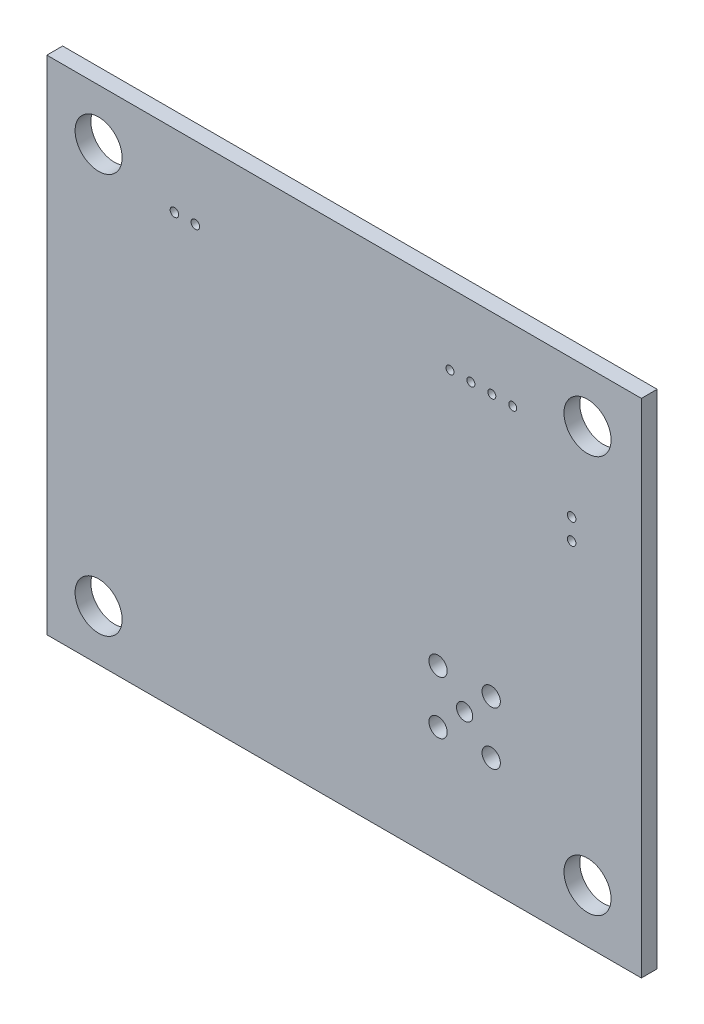
ISO-10303-21;
HEADER;
FILE_DESCRIPTION(('STEP AP214'),'2;1');
FILE_NAME('part.step','',(''),(''),'','','');
FILE_SCHEMA(('AUTOMOTIVE_DESIGN { 1 0 10303 214 1 1 1 1 }'));
ENDSEC;
DATA;
#1=APPLICATION_CONTEXT('core data for automotive mechanical design processes');
#2=APPLICATION_PROTOCOL_DEFINITION('international standard','automotive_design',2000,#1);
#3=PRODUCT_CONTEXT('',#1,'mechanical');
#4=PRODUCT('Part','Part','',(#3));
#5=PRODUCT_RELATED_PRODUCT_CATEGORY('part','',(#4));
#6=PRODUCT_DEFINITION_FORMATION('','',#4);
#7=PRODUCT_DEFINITION_CONTEXT('part definition',#1,'design');
#8=PRODUCT_DEFINITION('design','',#6,#7);
#9=PRODUCT_DEFINITION_SHAPE('','',#8);
#10=(LENGTH_UNIT() NAMED_UNIT(*) SI_UNIT(.MILLI.,.METRE.));
#11=(NAMED_UNIT(*) PLANE_ANGLE_UNIT() SI_UNIT($,.RADIAN.));
#12=(NAMED_UNIT(*) SI_UNIT($,.STERADIAN.) SOLID_ANGLE_UNIT());
#13=UNCERTAINTY_MEASURE_WITH_UNIT(LENGTH_MEASURE(1.E-05),#10,'distance_accuracy_value','');
#14=(GEOMETRIC_REPRESENTATION_CONTEXT(3) GLOBAL_UNCERTAINTY_ASSIGNED_CONTEXT((#13)) GLOBAL_UNIT_ASSIGNED_CONTEXT((#10,
#11,#12)) REPRESENTATION_CONTEXT('',''));
#15=CARTESIAN_POINT('',(0.,0.,0.));
#16=DIRECTION('',(0.,0.,1.));
#17=DIRECTION('',(1.,0.,0.));
#18=AXIS2_PLACEMENT_3D('',#15,#16,#17);
#19=CARTESIAN_POINT('',(180.75,-57.5,-0.046));
#20=DIRECTION('',(0.,0.,-1.));
#21=DIRECTION('',(0.,-1.,0.));
#22=AXIS2_PLACEMENT_3D('',#19,#20,#21);
#23=CYLINDRICAL_SURFACE('',#22,2.25);
#24=CARTESIAN_POINT('',(180.75,-57.5,0.));
#25=DIRECTION('',(0.,0.,-1.));
#26=DIRECTION('',(0.,-1.,0.));
#27=AXIS2_PLACEMENT_3D('',#24,#25,#26);
#28=CIRCLE('',#27,2.25);
#29=CARTESIAN_POINT('',(180.75,-59.75,0.));
#30=VERTEX_POINT('',#29);
#31=EDGE_CURVE('E274',#30,#30,#28,.T.);
#32=ORIENTED_EDGE('',*,*,#31,.T.);
#33=DIRECTION('',(0.,0.,1.));
#34=VECTOR('',#33,1.);
#35=CARTESIAN_POINT('',(180.75,-59.75,-0.046));
#36=LINE('',#35,#34);
#37=CARTESIAN_POINT('',(180.75,-59.75,1.51));
#38=VERTEX_POINT('',#37);
#39=EDGE_CURVE('E11',#30,#38,#36,.T.);
#40=ORIENTED_EDGE('',*,*,#39,.T.);
#41=CARTESIAN_POINT('',(180.75,-57.5,1.51));
#42=DIRECTION('',(0.,0.,-1.));
#43=DIRECTION('',(0.,-1.,0.));
#44=AXIS2_PLACEMENT_3D('',#41,#42,#43);
#45=CIRCLE('',#44,2.25);
#46=EDGE_CURVE('E267',#38,#38,#45,.T.);
#47=ORIENTED_EDGE('',*,*,#46,.F.);
#48=ORIENTED_EDGE('',*,*,#39,.F.);
#49=EDGE_LOOP('',(#32,#40,#47,#48));
#50=FACE_BOUND('',#49,.T.);
#51=ADVANCED_FACE('F17',(#50),#23,.F.);
#52=CARTESIAN_POINT('',(173.6,-59.4,-0.046));
#53=DIRECTION('',(0.,0.,-1.));
#54=DIRECTION('',(0.,-1.,0.));
#55=AXIS2_PLACEMENT_3D('',#52,#53,#54);
#56=CYLINDRICAL_SURFACE('',#55,0.381);
#57=CARTESIAN_POINT('',(173.6,-59.4,0.));
#58=DIRECTION('',(0.,0.,-1.));
#59=DIRECTION('',(0.,-1.,0.));
#60=AXIS2_PLACEMENT_3D('',#57,#58,#59);
#61=CIRCLE('',#60,0.381);
#62=CARTESIAN_POINT('',(173.6,-59.781,0.));
#63=VERTEX_POINT('',#62);
#64=EDGE_CURVE('E355',#63,#63,#61,.T.);
#65=ORIENTED_EDGE('',*,*,#64,.T.);
#66=DIRECTION('',(0.,0.,1.));
#67=VECTOR('',#66,1.);
#68=CARTESIAN_POINT('',(173.6,-59.781,-0.046));
#69=LINE('',#68,#67);
#70=CARTESIAN_POINT('',(173.6,-59.781,1.51));
#71=VERTEX_POINT('',#70);
#72=EDGE_CURVE('E25',#63,#71,#69,.T.);
#73=ORIENTED_EDGE('',*,*,#72,.T.);
#74=CARTESIAN_POINT('',(173.6,-59.4,1.51));
#75=DIRECTION('',(0.,0.,-1.));
#76=DIRECTION('',(0.,-1.,0.));
#77=AXIS2_PLACEMENT_3D('',#74,#75,#76);
#78=CIRCLE('',#77,0.381);
#79=EDGE_CURVE('E418',#71,#71,#78,.T.);
#80=ORIENTED_EDGE('',*,*,#79,.F.);
#81=ORIENTED_EDGE('',*,*,#72,.F.);
#82=EDGE_LOOP('',(#65,#73,#80,#81));
#83=FACE_BOUND('',#82,.T.);
#84=ADVANCED_FACE('F836',(#83),#56,.F.);
#85=CARTESIAN_POINT('',(171.600001,-59.4,-0.046));
#86=DIRECTION('',(0.,0.,-1.));
#87=DIRECTION('',(0.,-1.,0.));
#88=AXIS2_PLACEMENT_3D('',#85,#86,#87);
#89=CYLINDRICAL_SURFACE('',#88,0.381);
#90=CARTESIAN_POINT('',(171.600001,-59.4,0.));
#91=DIRECTION('',(0.,0.,-1.));
#92=DIRECTION('',(0.,-1.,0.));
#93=AXIS2_PLACEMENT_3D('',#90,#91,#92);
#94=CIRCLE('',#93,0.381);
#95=CARTESIAN_POINT('',(171.600001,-59.781,0.));
#96=VERTEX_POINT('',#95);
#97=EDGE_CURVE('E252',#96,#96,#94,.T.);
#98=ORIENTED_EDGE('',*,*,#97,.T.);
#99=DIRECTION('',(0.,0.,1.));
#100=VECTOR('',#99,1.);
#101=CARTESIAN_POINT('',(171.600001,-59.781,-0.046));
#102=LINE('',#101,#100);
#103=CARTESIAN_POINT('',(171.600001,-59.781,1.51));
#104=VERTEX_POINT('',#103);
#105=EDGE_CURVE('E289',#96,#104,#102,.T.);
#106=ORIENTED_EDGE('',*,*,#105,.T.);
#107=CARTESIAN_POINT('',(171.600001,-59.4,1.51));
#108=DIRECTION('',(0.,0.,-1.));
#109=DIRECTION('',(0.,-1.,0.));
#110=AXIS2_PLACEMENT_3D('',#107,#108,#109);
#111=CIRCLE('',#110,0.381);
#112=EDGE_CURVE('E362',#104,#104,#111,.T.);
#113=ORIENTED_EDGE('',*,*,#112,.F.);
#114=ORIENTED_EDGE('',*,*,#105,.F.);
#115=EDGE_LOOP('',(#98,#106,#113,#114));
#116=FACE_BOUND('',#115,.T.);
#117=ADVANCED_FACE('F827',(#116),#89,.F.);
#118=CARTESIAN_POINT('',(179.2326,-65.749999,-0.046));
#119=DIRECTION('',(0.,0.,-1.));
#120=DIRECTION('',(0.,-1.,0.));
#121=AXIS2_PLACEMENT_3D('',#118,#119,#120);
#122=CYLINDRICAL_SURFACE('',#121,0.4064);
#123=CARTESIAN_POINT('',(179.2326,-65.749999,0.));
#124=DIRECTION('',(0.,0.,-1.));
#125=DIRECTION('',(0.,-1.,0.));
#126=AXIS2_PLACEMENT_3D('',#123,#124,#125);
#127=CIRCLE('',#126,0.4064);
#128=CARTESIAN_POINT('',(179.2326,-66.156399,0.));
#129=VERTEX_POINT('',#128);
#130=EDGE_CURVE('E249',#129,#129,#127,.T.);
#131=ORIENTED_EDGE('',*,*,#130,.T.);
#132=DIRECTION('',(0.,0.,1.));
#133=VECTOR('',#132,1.);
#134=CARTESIAN_POINT('',(179.2326,-66.156399,-0.046));
#135=LINE('',#134,#133);
#136=CARTESIAN_POINT('',(179.2326,-66.156399,1.51));
#137=VERTEX_POINT('',#136);
#138=EDGE_CURVE('E292',#129,#137,#135,.T.);
#139=ORIENTED_EDGE('',*,*,#138,.T.);
#140=CARTESIAN_POINT('',(179.2326,-65.749999,1.51));
#141=DIRECTION('',(0.,0.,-1.));
#142=DIRECTION('',(0.,-1.,0.));
#143=AXIS2_PLACEMENT_3D('',#140,#141,#142);
#144=CIRCLE('',#143,0.4064);
#145=EDGE_CURVE('E358',#137,#137,#144,.T.);
#146=ORIENTED_EDGE('',*,*,#145,.F.);
#147=ORIENTED_EDGE('',*,*,#138,.F.);
#148=EDGE_LOOP('',(#131,#139,#146,#147));
#149=FACE_BOUND('',#148,.T.);
#150=ADVANCED_FACE('F817',(#149),#122,.F.);
#151=CARTESIAN_POINT('',(169.6,-59.4,-0.046));
#152=DIRECTION('',(0.,0.,-1.));
#153=DIRECTION('',(0.,-1.,0.));
#154=AXIS2_PLACEMENT_3D('',#151,#152,#153);
#155=CYLINDRICAL_SURFACE('',#154,0.381);
#156=CARTESIAN_POINT('',(169.6,-59.4,0.));
#157=DIRECTION('',(0.,0.,-1.));
#158=DIRECTION('',(0.,-1.,0.));
#159=AXIS2_PLACEMENT_3D('',#156,#157,#158);
#160=CIRCLE('',#159,0.381);
#161=CARTESIAN_POINT('',(169.6,-59.781,0.));
#162=VERTEX_POINT('',#161);
#163=EDGE_CURVE('E253',#162,#162,#160,.T.);
#164=ORIENTED_EDGE('',*,*,#163,.T.);
#165=DIRECTION('',(0.,0.,1.));
#166=VECTOR('',#165,1.);
#167=CARTESIAN_POINT('',(169.6,-59.781,-0.046));
#168=LINE('',#167,#166);
#169=CARTESIAN_POINT('',(169.6,-59.781,1.51));
#170=VERTEX_POINT('',#169);
#171=EDGE_CURVE('E247',#162,#170,#168,.T.);
#172=ORIENTED_EDGE('',*,*,#171,.T.);
#173=CARTESIAN_POINT('',(169.6,-59.4,1.51));
#174=DIRECTION('',(0.,0.,-1.));
#175=DIRECTION('',(0.,-1.,0.));
#176=AXIS2_PLACEMENT_3D('',#173,#174,#175);
#177=CIRCLE('',#176,0.381);
#178=EDGE_CURVE('E363',#170,#170,#177,.T.);
#179=ORIENTED_EDGE('',*,*,#178,.F.);
#180=ORIENTED_EDGE('',*,*,#171,.F.);
#181=EDGE_LOOP('',(#164,#172,#179,#180));
#182=FACE_BOUND('',#181,.T.);
#183=ADVANCED_FACE('F807',(#182),#155,.F.);
#184=CARTESIAN_POINT('',(167.600002,-59.4,-0.046));
#185=DIRECTION('',(0.,0.,-1.));
#186=DIRECTION('',(0.,-1.,0.));
#187=AXIS2_PLACEMENT_3D('',#184,#185,#186);
#188=CYLINDRICAL_SURFACE('',#187,0.381);
#189=CARTESIAN_POINT('',(167.600002,-59.4,0.));
#190=DIRECTION('',(0.,0.,-1.));
#191=DIRECTION('',(0.,-1.,0.));
#192=AXIS2_PLACEMENT_3D('',#189,#190,#191);
#193=CIRCLE('',#192,0.381);
#194=CARTESIAN_POINT('',(167.600002,-59.781,0.));
#195=VERTEX_POINT('',#194);
#196=EDGE_CURVE('E301',#195,#195,#193,.T.);
#197=ORIENTED_EDGE('',*,*,#196,.T.);
#198=DIRECTION('',(0.,0.,1.));
#199=VECTOR('',#198,1.);
#200=CARTESIAN_POINT('',(167.600002,-59.781,-0.046));
#201=LINE('',#200,#199);
#202=CARTESIAN_POINT('',(167.600002,-59.781,1.51));
#203=VERTEX_POINT('',#202);
#204=EDGE_CURVE('E244',#195,#203,#201,.T.);
#205=ORIENTED_EDGE('',*,*,#204,.T.);
#206=CARTESIAN_POINT('',(167.600002,-59.4,1.51));
#207=DIRECTION('',(0.,0.,-1.));
#208=DIRECTION('',(0.,-1.,0.));
#209=AXIS2_PLACEMENT_3D('',#206,#207,#208);
#210=CIRCLE('',#209,0.381);
#211=EDGE_CURVE('E370',#203,#203,#210,.T.);
#212=ORIENTED_EDGE('',*,*,#211,.F.);
#213=ORIENTED_EDGE('',*,*,#204,.F.);
#214=EDGE_LOOP('',(#197,#205,#212,#213));
#215=FACE_BOUND('',#214,.T.);
#216=ADVANCED_FACE('F797',(#215),#188,.F.);
#217=CARTESIAN_POINT('',(179.2326,-67.75,-0.046));
#218=DIRECTION('',(0.,0.,-1.));
#219=DIRECTION('',(0.,-1.,0.));
#220=AXIS2_PLACEMENT_3D('',#217,#218,#219);
#221=CYLINDRICAL_SURFACE('',#220,0.4064);
#222=CARTESIAN_POINT('',(179.2326,-67.75,0.));
#223=DIRECTION('',(0.,0.,-1.));
#224=DIRECTION('',(0.,-1.,0.));
#225=AXIS2_PLACEMENT_3D('',#222,#223,#224);
#226=CIRCLE('',#225,0.4064);
#227=CARTESIAN_POINT('',(179.2326,-68.1564,0.));
#228=VERTEX_POINT('',#227);
#229=EDGE_CURVE('E279',#228,#228,#226,.T.);
#230=ORIENTED_EDGE('',*,*,#229,.T.);
#231=DIRECTION('',(0.,0.,1.));
#232=VECTOR('',#231,1.);
#233=CARTESIAN_POINT('',(179.2326,-68.1564,-0.046));
#234=LINE('',#233,#232);
#235=CARTESIAN_POINT('',(179.2326,-68.1564,1.51));
#236=VERTEX_POINT('',#235);
#237=EDGE_CURVE('E248',#228,#236,#234,.T.);
#238=ORIENTED_EDGE('',*,*,#237,.T.);
#239=CARTESIAN_POINT('',(179.2326,-67.75,1.51));
#240=DIRECTION('',(0.,0.,-1.));
#241=DIRECTION('',(0.,-1.,0.));
#242=AXIS2_PLACEMENT_3D('',#239,#240,#241);
#243=CIRCLE('',#242,0.4064);
#244=EDGE_CURVE('E338',#236,#236,#243,.T.);
#245=ORIENTED_EDGE('',*,*,#244,.F.);
#246=ORIENTED_EDGE('',*,*,#237,.F.);
#247=EDGE_LOOP('',(#230,#238,#245,#246));
#248=FACE_BOUND('',#247,.T.);
#249=ADVANCED_FACE('F788',(#248),#221,.F.);
#250=CARTESIAN_POINT('',(143.25,-59.5174,-0.046));
#251=DIRECTION('',(0.,0.,-1.));
#252=DIRECTION('',(0.,-1.,0.));
#253=AXIS2_PLACEMENT_3D('',#250,#251,#252);
#254=CYLINDRICAL_SURFACE('',#253,0.4064);
#255=CARTESIAN_POINT('',(143.25,-59.5174,0.));
#256=DIRECTION('',(0.,0.,-1.));
#257=DIRECTION('',(0.,-1.,0.));
#258=AXIS2_PLACEMENT_3D('',#255,#256,#257);
#259=CIRCLE('',#258,0.4064);
#260=CARTESIAN_POINT('',(143.25,-59.9238,0.));
#261=VERTEX_POINT('',#260);
#262=EDGE_CURVE('E275',#261,#261,#259,.T.);
#263=ORIENTED_EDGE('',*,*,#262,.T.);
#264=DIRECTION('',(0.,0.,1.));
#265=VECTOR('',#264,1.);
#266=CARTESIAN_POINT('',(143.25,-59.9238,-0.046));
#267=LINE('',#266,#265);
#268=CARTESIAN_POINT('',(143.25,-59.9238,1.51));
#269=VERTEX_POINT('',#268);
#270=EDGE_CURVE('E435',#261,#269,#267,.T.);
#271=ORIENTED_EDGE('',*,*,#270,.T.);
#272=CARTESIAN_POINT('',(143.25,-59.5174,1.51));
#273=DIRECTION('',(0.,0.,-1.));
#274=DIRECTION('',(0.,-1.,0.));
#275=AXIS2_PLACEMENT_3D('',#272,#273,#274);
#276=CIRCLE('',#275,0.4064);
#277=EDGE_CURVE('E334',#269,#269,#276,.T.);
#278=ORIENTED_EDGE('',*,*,#277,.F.);
#279=ORIENTED_EDGE('',*,*,#270,.F.);
#280=EDGE_LOOP('',(#263,#271,#278,#279));
#281=FACE_BOUND('',#280,.T.);
#282=ADVANCED_FACE('F778',(#281),#254,.F.);
#283=CARTESIAN_POINT('',(141.249999,-59.5174,-0.046));
#284=DIRECTION('',(0.,0.,-1.));
#285=DIRECTION('',(0.,-1.,0.));
#286=AXIS2_PLACEMENT_3D('',#283,#284,#285);
#287=CYLINDRICAL_SURFACE('',#286,0.4064);
#288=CARTESIAN_POINT('',(141.249999,-59.5174,0.));
#289=DIRECTION('',(0.,0.,-1.));
#290=DIRECTION('',(0.,-1.,0.));
#291=AXIS2_PLACEMENT_3D('',#288,#289,#290);
#292=CIRCLE('',#291,0.4064);
#293=CARTESIAN_POINT('',(141.249999,-59.9238,0.));
#294=VERTEX_POINT('',#293);
#295=EDGE_CURVE('E280',#294,#294,#292,.T.);
#296=ORIENTED_EDGE('',*,*,#295,.T.);
#297=DIRECTION('',(0.,0.,1.));
#298=VECTOR('',#297,1.);
#299=CARTESIAN_POINT('',(141.249999,-59.9238,-0.046));
#300=LINE('',#299,#298);
#301=CARTESIAN_POINT('',(141.249999,-59.9238,1.51));
#302=VERTEX_POINT('',#301);
#303=EDGE_CURVE('E400',#294,#302,#300,.T.);
#304=ORIENTED_EDGE('',*,*,#303,.T.);
#305=CARTESIAN_POINT('',(141.249999,-59.5174,1.51));
#306=DIRECTION('',(0.,0.,-1.));
#307=DIRECTION('',(0.,-1.,0.));
#308=AXIS2_PLACEMENT_3D('',#305,#306,#307);
#309=CIRCLE('',#308,0.4064);
#310=EDGE_CURVE('E339',#302,#302,#309,.T.);
#311=ORIENTED_EDGE('',*,*,#310,.F.);
#312=ORIENTED_EDGE('',*,*,#303,.F.);
#313=EDGE_LOOP('',(#296,#304,#311,#312));
#314=FACE_BOUND('',#313,.T.);
#315=ADVANCED_FACE('F768',(#314),#287,.F.);
#316=CARTESIAN_POINT('',(134.,-57.5,-0.046));
#317=DIRECTION('',(0.,0.,-1.));
#318=DIRECTION('',(0.,-1.,0.));
#319=AXIS2_PLACEMENT_3D('',#316,#317,#318);
#320=CYLINDRICAL_SURFACE('',#319,2.25);
#321=CARTESIAN_POINT('',(134.,-57.5,0.));
#322=DIRECTION('',(0.,0.,-1.));
#323=DIRECTION('',(0.,-1.,0.));
#324=AXIS2_PLACEMENT_3D('',#321,#322,#323);
#325=CIRCLE('',#324,2.25);
#326=CARTESIAN_POINT('',(134.,-59.75,0.));
#327=VERTEX_POINT('',#326);
#328=EDGE_CURVE('E281',#327,#327,#325,.T.);
#329=ORIENTED_EDGE('',*,*,#328,.T.);
#330=DIRECTION('',(0.,0.,1.));
#331=VECTOR('',#330,1.);
#332=CARTESIAN_POINT('',(134.,-59.75,-0.046));
#333=LINE('',#332,#331);
#334=CARTESIAN_POINT('',(134.,-59.75,1.51));
#335=VERTEX_POINT('',#334);
#336=EDGE_CURVE('E296',#327,#335,#333,.T.);
#337=ORIENTED_EDGE('',*,*,#336,.T.);
#338=CARTESIAN_POINT('',(134.,-57.5,1.51));
#339=DIRECTION('',(0.,0.,-1.));
#340=DIRECTION('',(0.,-1.,0.));
#341=AXIS2_PLACEMENT_3D('',#338,#339,#340);
#342=CIRCLE('',#341,2.25);
#343=EDGE_CURVE('E397',#335,#335,#342,.T.);
#344=ORIENTED_EDGE('',*,*,#343,.F.);
#345=ORIENTED_EDGE('',*,*,#336,.F.);
#346=EDGE_LOOP('',(#329,#337,#344,#345));
#347=FACE_BOUND('',#346,.T.);
#348=ADVANCED_FACE('F758',(#347),#320,.F.);
#349=CARTESIAN_POINT('',(171.54,-84.46,-0.046));
#350=DIRECTION('',(0.,0.,-1.));
#351=DIRECTION('',(0.,-1.,0.));
#352=AXIS2_PLACEMENT_3D('',#349,#350,#351);
#353=CYLINDRICAL_SURFACE('',#352,0.875);
#354=CARTESIAN_POINT('',(171.54,-84.46,0.));
#355=DIRECTION('',(0.,0.,-1.));
#356=DIRECTION('',(0.,-1.,0.));
#357=AXIS2_PLACEMENT_3D('',#354,#355,#356);
#358=CIRCLE('',#357,0.875);
#359=CARTESIAN_POINT('',(171.54,-85.335,0.));
#360=VERTEX_POINT('',#359);
#361=EDGE_CURVE('E284',#360,#360,#358,.T.);
#362=ORIENTED_EDGE('',*,*,#361,.T.);
#363=DIRECTION('',(0.,0.,1.));
#364=VECTOR('',#363,1.);
#365=CARTESIAN_POINT('',(171.54,-85.335,-0.046));
#366=LINE('',#365,#364);
#367=CARTESIAN_POINT('',(171.54,-85.335,1.51));
#368=VERTEX_POINT('',#367);
#369=EDGE_CURVE('E293',#360,#368,#366,.T.);
#370=ORIENTED_EDGE('',*,*,#369,.T.);
#371=CARTESIAN_POINT('',(171.54,-84.46,1.51));
#372=DIRECTION('',(0.,0.,-1.));
#373=DIRECTION('',(0.,-1.,0.));
#374=AXIS2_PLACEMENT_3D('',#371,#372,#373);
#375=CIRCLE('',#374,0.875);
#376=EDGE_CURVE('E390',#368,#368,#375,.T.);
#377=ORIENTED_EDGE('',*,*,#376,.F.);
#378=ORIENTED_EDGE('',*,*,#369,.F.);
#379=EDGE_LOOP('',(#362,#370,#377,#378));
#380=FACE_BOUND('',#379,.T.);
#381=ADVANCED_FACE('F749',(#380),#353,.F.);
#382=CARTESIAN_POINT('',(166.46,-84.46,-0.046));
#383=DIRECTION('',(0.,0.,-1.));
#384=DIRECTION('',(0.,-1.,0.));
#385=AXIS2_PLACEMENT_3D('',#382,#383,#384);
#386=CYLINDRICAL_SURFACE('',#385,0.875);
#387=CARTESIAN_POINT('',(166.46,-84.46,0.));
#388=DIRECTION('',(0.,0.,-1.));
#389=DIRECTION('',(0.,-1.,0.));
#390=AXIS2_PLACEMENT_3D('',#387,#388,#389);
#391=CIRCLE('',#390,0.875);
#392=CARTESIAN_POINT('',(166.46,-85.335,0.));
#393=VERTEX_POINT('',#392);
#394=EDGE_CURVE('E306',#393,#393,#391,.T.);
#395=ORIENTED_EDGE('',*,*,#394,.T.);
#396=DIRECTION('',(0.,0.,1.));
#397=VECTOR('',#396,1.);
#398=CARTESIAN_POINT('',(166.46,-85.335,-0.046));
#399=LINE('',#398,#397);
#400=CARTESIAN_POINT('',(166.46,-85.335,1.51));
#401=VERTEX_POINT('',#400);
#402=EDGE_CURVE('E297',#393,#401,#399,.T.);
#403=ORIENTED_EDGE('',*,*,#402,.T.);
#404=CARTESIAN_POINT('',(166.46,-84.46,1.51));
#405=DIRECTION('',(0.,0.,-1.));
#406=DIRECTION('',(0.,-1.,0.));
#407=AXIS2_PLACEMENT_3D('',#404,#405,#406);
#408=CIRCLE('',#407,0.875);
#409=EDGE_CURVE('E386',#401,#401,#408,.T.);
#410=ORIENTED_EDGE('',*,*,#409,.F.);
#411=ORIENTED_EDGE('',*,*,#402,.F.);
#412=EDGE_LOOP('',(#395,#403,#410,#411));
#413=FACE_BOUND('',#412,.T.);
#414=ADVANCED_FACE('F740',(#413),#386,.F.);
#415=CARTESIAN_POINT('',(169.,-87.,-0.046));
#416=DIRECTION('',(0.,0.,-1.));
#417=DIRECTION('',(0.,-1.,0.));
#418=AXIS2_PLACEMENT_3D('',#415,#416,#417);
#419=CYLINDRICAL_SURFACE('',#418,0.775);
#420=CARTESIAN_POINT('',(169.,-87.,0.));
#421=DIRECTION('',(0.,0.,-1.));
#422=DIRECTION('',(0.,-1.,0.));
#423=AXIS2_PLACEMENT_3D('',#420,#421,#422);
#424=CIRCLE('',#423,0.775);
#425=CARTESIAN_POINT('',(169.,-87.775,0.));
#426=VERTEX_POINT('',#425);
#427=EDGE_CURVE('E302',#426,#426,#424,.T.);
#428=ORIENTED_EDGE('',*,*,#427,.T.);
#429=DIRECTION('',(0.,0.,1.));
#430=VECTOR('',#429,1.);
#431=CARTESIAN_POINT('',(169.,-87.775,-0.046));
#432=LINE('',#431,#430);
#433=CARTESIAN_POINT('',(169.,-87.775,1.51));
#434=VERTEX_POINT('',#433);
#435=EDGE_CURVE('E428',#426,#434,#432,.T.);
#436=ORIENTED_EDGE('',*,*,#435,.T.);
#437=CARTESIAN_POINT('',(169.,-87.,1.51));
#438=DIRECTION('',(0.,0.,-1.));
#439=DIRECTION('',(0.,-1.,0.));
#440=AXIS2_PLACEMENT_3D('',#437,#438,#439);
#441=CIRCLE('',#440,0.775);
#442=EDGE_CURVE('E385',#434,#434,#441,.T.);
#443=ORIENTED_EDGE('',*,*,#442,.F.);
#444=ORIENTED_EDGE('',*,*,#435,.F.);
#445=EDGE_LOOP('',(#428,#436,#443,#444));
#446=FACE_BOUND('',#445,.T.);
#447=ADVANCED_FACE('F730',(#446),#419,.F.);
#448=CARTESIAN_POINT('',(171.54,-89.54,-0.046));
#449=DIRECTION('',(0.,0.,-1.));
#450=DIRECTION('',(0.,-1.,0.));
#451=AXIS2_PLACEMENT_3D('',#448,#449,#450);
#452=CYLINDRICAL_SURFACE('',#451,0.875);
#453=CARTESIAN_POINT('',(171.54,-89.54,0.));
#454=DIRECTION('',(0.,0.,-1.));
#455=DIRECTION('',(0.,-1.,0.));
#456=AXIS2_PLACEMENT_3D('',#453,#454,#455);
#457=CIRCLE('',#456,0.875);
#458=CARTESIAN_POINT('',(171.54,-90.415,0.));
#459=VERTEX_POINT('',#458);
#460=EDGE_CURVE('E307',#459,#459,#457,.T.);
#461=ORIENTED_EDGE('',*,*,#460,.T.);
#462=DIRECTION('',(0.,0.,1.));
#463=VECTOR('',#462,1.);
#464=CARTESIAN_POINT('',(171.54,-90.415,-0.046));
#465=LINE('',#464,#463);
#466=CARTESIAN_POINT('',(171.54,-90.415,1.51));
#467=VERTEX_POINT('',#466);
#468=EDGE_CURVE('E425',#459,#467,#465,.T.);
#469=ORIENTED_EDGE('',*,*,#468,.T.);
#470=CARTESIAN_POINT('',(171.54,-89.54,1.51));
#471=DIRECTION('',(0.,0.,-1.));
#472=DIRECTION('',(0.,-1.,0.));
#473=AXIS2_PLACEMENT_3D('',#470,#471,#472);
#474=CIRCLE('',#473,0.875);
#475=EDGE_CURVE('E381',#467,#467,#474,.T.);
#476=ORIENTED_EDGE('',*,*,#475,.F.);
#477=ORIENTED_EDGE('',*,*,#468,.F.);
#478=EDGE_LOOP('',(#461,#469,#476,#477));
#479=FACE_BOUND('',#478,.T.);
#480=ADVANCED_FACE('F719',(#479),#452,.F.);
#481=CARTESIAN_POINT('',(180.75,-95.5,-0.046));
#482=DIRECTION('',(0.,0.,-1.));
#483=DIRECTION('',(0.,-1.,0.));
#484=AXIS2_PLACEMENT_3D('',#481,#482,#483);
#485=CYLINDRICAL_SURFACE('',#484,2.25);
#486=CARTESIAN_POINT('',(180.75,-95.5,0.));
#487=DIRECTION('',(0.,0.,-1.));
#488=DIRECTION('',(0.,-1.,0.));
#489=AXIS2_PLACEMENT_3D('',#486,#487,#488);
#490=CIRCLE('',#489,2.25);
#491=CARTESIAN_POINT('',(180.75,-97.75,0.));
#492=VERTEX_POINT('',#491);
#493=EDGE_CURVE('E311',#492,#492,#490,.T.);
#494=ORIENTED_EDGE('',*,*,#493,.T.);
#495=DIRECTION('',(0.,0.,1.));
#496=VECTOR('',#495,1.);
#497=CARTESIAN_POINT('',(180.75,-97.75,-0.046));
#498=LINE('',#497,#496);
#499=CARTESIAN_POINT('',(180.75,-97.75,1.51));
#500=VERTEX_POINT('',#499);
#501=EDGE_CURVE('E320',#492,#500,#498,.T.);
#502=ORIENTED_EDGE('',*,*,#501,.T.);
#503=CARTESIAN_POINT('',(180.75,-95.5,1.51));
#504=DIRECTION('',(0.,0.,-1.));
#505=DIRECTION('',(0.,-1.,0.));
#506=AXIS2_PLACEMENT_3D('',#503,#504,#505);
#507=CIRCLE('',#506,2.25);
#508=EDGE_CURVE('E377',#500,#500,#507,.T.);
#509=ORIENTED_EDGE('',*,*,#508,.F.);
#510=ORIENTED_EDGE('',*,*,#501,.F.);
#511=EDGE_LOOP('',(#494,#502,#509,#510));
#512=FACE_BOUND('',#511,.T.);
#513=ADVANCED_FACE('F709',(#512),#485,.F.);
#514=CARTESIAN_POINT('',(166.46,-89.54,-0.046));
#515=DIRECTION('',(0.,0.,-1.));
#516=DIRECTION('',(0.,-1.,0.));
#517=AXIS2_PLACEMENT_3D('',#514,#515,#516);
#518=CYLINDRICAL_SURFACE('',#517,0.875);
#519=CARTESIAN_POINT('',(166.46,-89.54,0.));
#520=DIRECTION('',(0.,0.,-1.));
#521=DIRECTION('',(0.,-1.,0.));
#522=AXIS2_PLACEMENT_3D('',#519,#520,#521);
#523=CIRCLE('',#522,0.875);
#524=CARTESIAN_POINT('',(166.46,-90.415,0.));
#525=VERTEX_POINT('',#524);
#526=EDGE_CURVE('E321',#525,#525,#523,.T.);
#527=ORIENTED_EDGE('',*,*,#526,.T.);
#528=DIRECTION('',(0.,0.,1.));
#529=VECTOR('',#528,1.);
#530=CARTESIAN_POINT('',(166.46,-90.415,-0.046));
#531=LINE('',#530,#529);
#532=CARTESIAN_POINT('',(166.46,-90.415,1.51));
#533=VERTEX_POINT('',#532);
#534=EDGE_CURVE('E266',#525,#533,#531,.T.);
#535=ORIENTED_EDGE('',*,*,#534,.T.);
#536=CARTESIAN_POINT('',(166.46,-89.54,1.51));
#537=DIRECTION('',(0.,0.,-1.));
#538=DIRECTION('',(0.,-1.,0.));
#539=AXIS2_PLACEMENT_3D('',#536,#537,#538);
#540=CIRCLE('',#539,0.875);
#541=EDGE_CURVE('E369',#533,#533,#540,.T.);
#542=ORIENTED_EDGE('',*,*,#541,.F.);
#543=ORIENTED_EDGE('',*,*,#534,.F.);
#544=EDGE_LOOP('',(#527,#535,#542,#543));
#545=FACE_BOUND('',#544,.T.);
#546=ADVANCED_FACE('F699',(#545),#518,.F.);
#547=CARTESIAN_POINT('',(134.,-95.75,-0.046));
#548=DIRECTION('',(0.,0.,-1.));
#549=DIRECTION('',(0.,-1.,0.));
#550=AXIS2_PLACEMENT_3D('',#547,#548,#549);
#551=CYLINDRICAL_SURFACE('',#550,2.25);
#552=CARTESIAN_POINT('',(134.,-95.75,0.));
#553=DIRECTION('',(0.,0.,-1.));
#554=DIRECTION('',(0.,-1.,0.));
#555=AXIS2_PLACEMENT_3D('',#552,#553,#554);
#556=CIRCLE('',#555,2.25);
#557=CARTESIAN_POINT('',(134.,-98.,0.));
#558=VERTEX_POINT('',#557);
#559=EDGE_CURVE('E317',#558,#558,#556,.T.);
#560=ORIENTED_EDGE('',*,*,#559,.T.);
#561=DIRECTION('',(0.,0.,1.));
#562=VECTOR('',#561,1.);
#563=CARTESIAN_POINT('',(134.,-98.,-0.046));
#564=LINE('',#563,#562);
#565=CARTESIAN_POINT('',(134.,-98.,1.51));
#566=VERTEX_POINT('',#565);
#567=EDGE_CURVE('E263',#558,#566,#564,.T.);
#568=ORIENTED_EDGE('',*,*,#567,.T.);
#569=CARTESIAN_POINT('',(134.,-95.75,1.51));
#570=DIRECTION('',(0.,0.,-1.));
#571=DIRECTION('',(0.,-1.,0.));
#572=AXIS2_PLACEMENT_3D('',#569,#570,#571);
#573=CIRCLE('',#572,2.25);
#574=EDGE_CURVE('E273',#566,#566,#573,.T.);
#575=ORIENTED_EDGE('',*,*,#574,.F.);
#576=ORIENTED_EDGE('',*,*,#567,.F.);
#577=EDGE_LOOP('',(#560,#568,#575,#576));
#578=FACE_BOUND('',#577,.T.);
#579=ADVANCED_FACE('F689',(#578),#551,.F.);
#580=CARTESIAN_POINT('',(129.05,-52.6,0.));
#581=DIRECTION('',(0.,1.,0.));
#582=DIRECTION('',(1.,0.,0.));
#583=AXIS2_PLACEMENT_3D('',#580,#581,#582);
#584=PLANE('',#583);
#585=DIRECTION('',(0.,0.,1.));
#586=VECTOR('',#585,1.);
#587=CARTESIAN_POINT('',(129.05,-52.6,0.));
#588=LINE('',#587,#586);
#589=CARTESIAN_POINT('',(129.05,-52.6,0.));
#590=VERTEX_POINT('',#589);
#591=CARTESIAN_POINT('',(129.05,-52.6,1.51));
#592=VERTEX_POINT('',#591);
#593=EDGE_CURVE('E262',#590,#592,#588,.T.);
#594=ORIENTED_EDGE('',*,*,#593,.T.);
#595=DIRECTION('',(1.,0.,0.));
#596=VECTOR('',#595,1.);
#597=CARTESIAN_POINT('',(129.05,-52.6,1.51));
#598=LINE('',#597,#596);
#599=CARTESIAN_POINT('',(185.9,-52.6,1.51));
#600=VERTEX_POINT('',#599);
#601=EDGE_CURVE('E270',#592,#600,#598,.T.);
#602=ORIENTED_EDGE('',*,*,#601,.T.);
#603=DIRECTION('',(0.,0.,1.));
#604=VECTOR('',#603,1.);
#605=CARTESIAN_POINT('',(185.9,-52.6,0.));
#606=LINE('',#605,#604);
#607=CARTESIAN_POINT('',(185.9,-52.6,0.));
#608=VERTEX_POINT('',#607);
#609=EDGE_CURVE('E230',#608,#600,#606,.T.);
#610=ORIENTED_EDGE('',*,*,#609,.F.);
#611=DIRECTION('',(1.,0.,0.));
#612=VECTOR('',#611,1.);
#613=CARTESIAN_POINT('',(129.05,-52.6,0.));
#614=LINE('',#613,#612);
#615=EDGE_CURVE('E213',#590,#608,#614,.T.);
#616=ORIENTED_EDGE('',*,*,#615,.F.);
#617=EDGE_LOOP('',(#594,#602,#610,#616));
#618=FACE_BOUND('',#617,.T.);
#619=ADVANCED_FACE('F679',(#618),#584,.T.);
#620=CARTESIAN_POINT('',(0.,0.,1.51));
#621=DIRECTION('',(0.,0.,1.));
#622=DIRECTION('',(1.,0.,0.));
#623=AXIS2_PLACEMENT_3D('',#620,#621,#622);
#624=PLANE('',#623);
#625=ORIENTED_EDGE('',*,*,#46,.T.);
#626=EDGE_LOOP('',(#625));
#627=FACE_BOUND('',#626,.T.);
#628=ORIENTED_EDGE('',*,*,#79,.T.);
#629=EDGE_LOOP('',(#628));
#630=FACE_BOUND('',#629,.T.);
#631=ORIENTED_EDGE('',*,*,#112,.T.);
#632=EDGE_LOOP('',(#631));
#633=FACE_BOUND('',#632,.T.);
#634=ORIENTED_EDGE('',*,*,#145,.T.);
#635=EDGE_LOOP('',(#634));
#636=FACE_BOUND('',#635,.T.);
#637=ORIENTED_EDGE('',*,*,#178,.T.);
#638=EDGE_LOOP('',(#637));
#639=FACE_BOUND('',#638,.T.);
#640=ORIENTED_EDGE('',*,*,#211,.T.);
#641=EDGE_LOOP('',(#640));
#642=FACE_BOUND('',#641,.T.);
#643=ORIENTED_EDGE('',*,*,#244,.T.);
#644=EDGE_LOOP('',(#643));
#645=FACE_BOUND('',#644,.T.);
#646=ORIENTED_EDGE('',*,*,#277,.T.);
#647=EDGE_LOOP('',(#646));
#648=FACE_BOUND('',#647,.T.);
#649=ORIENTED_EDGE('',*,*,#310,.T.);
#650=EDGE_LOOP('',(#649));
#651=FACE_BOUND('',#650,.T.);
#652=ORIENTED_EDGE('',*,*,#343,.T.);
#653=EDGE_LOOP('',(#652));
#654=FACE_BOUND('',#653,.T.);
#655=ORIENTED_EDGE('',*,*,#376,.T.);
#656=EDGE_LOOP('',(#655));
#657=FACE_BOUND('',#656,.T.);
#658=ORIENTED_EDGE('',*,*,#409,.T.);
#659=EDGE_LOOP('',(#658));
#660=FACE_BOUND('',#659,.T.);
#661=ORIENTED_EDGE('',*,*,#442,.T.);
#662=EDGE_LOOP('',(#661));
#663=FACE_BOUND('',#662,.T.);
#664=ORIENTED_EDGE('',*,*,#475,.T.);
#665=EDGE_LOOP('',(#664));
#666=FACE_BOUND('',#665,.T.);
#667=ORIENTED_EDGE('',*,*,#508,.T.);
#668=EDGE_LOOP('',(#667));
#669=FACE_BOUND('',#668,.T.);
#670=ORIENTED_EDGE('',*,*,#541,.T.);
#671=EDGE_LOOP('',(#670));
#672=FACE_BOUND('',#671,.T.);
#673=ORIENTED_EDGE('',*,*,#574,.T.);
#674=EDGE_LOOP('',(#673));
#675=FACE_BOUND('',#674,.T.);
#676=DIRECTION('',(-1.,0.,0.));
#677=VECTOR('',#676,1.);
#678=CARTESIAN_POINT('',(185.9,-100.6,1.51));
#679=LINE('',#678,#677);
#680=CARTESIAN_POINT('',(185.9,-100.6,1.51));
#681=VERTEX_POINT('',#680);
#682=CARTESIAN_POINT('',(129.05,-100.6,1.51));
#683=VERTEX_POINT('',#682);
#684=EDGE_CURVE('E236',#681,#683,#679,.T.);
#685=ORIENTED_EDGE('',*,*,#684,.F.);
#686=DIRECTION('',(0.,-1.,0.));
#687=VECTOR('',#686,1.);
#688=CARTESIAN_POINT('',(185.9,-52.6,1.51));
#689=LINE('',#688,#687);
#690=EDGE_CURVE('E220',#600,#681,#689,.T.);
#691=ORIENTED_EDGE('',*,*,#690,.F.);
#692=ORIENTED_EDGE('',*,*,#601,.F.);
#693=DIRECTION('',(0.,1.,0.));
#694=VECTOR('',#693,1.);
#695=CARTESIAN_POINT('',(129.05,-100.6,1.51));
#696=LINE('',#695,#694);
#697=EDGE_CURVE('E219',#683,#592,#696,.T.);
#698=ORIENTED_EDGE('',*,*,#697,.F.);
#699=EDGE_LOOP('',(#685,#691,#692,#698));
#700=FACE_BOUND('',#699,.T.);
#701=ADVANCED_FACE('F668',(#627,#630,#633,#636,#639,#642,#645,#648,#651,#654,#657,#660,#663,
#666,#669,#672,#675,#700),#624,.T.);
#702=CARTESIAN_POINT('',(0.,0.,0.));
#703=DIRECTION('',(0.,0.,1.));
#704=DIRECTION('',(1.,0.,0.));
#705=AXIS2_PLACEMENT_3D('',#702,#703,#704);
#706=PLANE('',#705);
#707=ORIENTED_EDGE('',*,*,#31,.F.);
#708=EDGE_LOOP('',(#707));
#709=FACE_BOUND('',#708,.T.);
#710=ORIENTED_EDGE('',*,*,#64,.F.);
#711=EDGE_LOOP('',(#710));
#712=FACE_BOUND('',#711,.T.);
#713=ORIENTED_EDGE('',*,*,#97,.F.);
#714=EDGE_LOOP('',(#713));
#715=FACE_BOUND('',#714,.T.);
#716=ORIENTED_EDGE('',*,*,#130,.F.);
#717=EDGE_LOOP('',(#716));
#718=FACE_BOUND('',#717,.T.);
#719=ORIENTED_EDGE('',*,*,#163,.F.);
#720=EDGE_LOOP('',(#719));
#721=FACE_BOUND('',#720,.T.);
#722=ORIENTED_EDGE('',*,*,#196,.F.);
#723=EDGE_LOOP('',(#722));
#724=FACE_BOUND('',#723,.T.);
#725=ORIENTED_EDGE('',*,*,#229,.F.);
#726=EDGE_LOOP('',(#725));
#727=FACE_BOUND('',#726,.T.);
#728=ORIENTED_EDGE('',*,*,#262,.F.);
#729=EDGE_LOOP('',(#728));
#730=FACE_BOUND('',#729,.T.);
#731=ORIENTED_EDGE('',*,*,#295,.F.);
#732=EDGE_LOOP('',(#731));
#733=FACE_BOUND('',#732,.T.);
#734=ORIENTED_EDGE('',*,*,#328,.F.);
#735=EDGE_LOOP('',(#734));
#736=FACE_BOUND('',#735,.T.);
#737=ORIENTED_EDGE('',*,*,#361,.F.);
#738=EDGE_LOOP('',(#737));
#739=FACE_BOUND('',#738,.T.);
#740=ORIENTED_EDGE('',*,*,#394,.F.);
#741=EDGE_LOOP('',(#740));
#742=FACE_BOUND('',#741,.T.);
#743=ORIENTED_EDGE('',*,*,#427,.F.);
#744=EDGE_LOOP('',(#743));
#745=FACE_BOUND('',#744,.T.);
#746=ORIENTED_EDGE('',*,*,#460,.F.);
#747=EDGE_LOOP('',(#746));
#748=FACE_BOUND('',#747,.T.);
#749=ORIENTED_EDGE('',*,*,#493,.F.);
#750=EDGE_LOOP('',(#749));
#751=FACE_BOUND('',#750,.T.);
#752=ORIENTED_EDGE('',*,*,#526,.F.);
#753=EDGE_LOOP('',(#752));
#754=FACE_BOUND('',#753,.T.);
#755=ORIENTED_EDGE('',*,*,#559,.F.);
#756=EDGE_LOOP('',(#755));
#757=FACE_BOUND('',#756,.T.);
#758=DIRECTION('',(0.,1.,0.));
#759=VECTOR('',#758,1.);
#760=CARTESIAN_POINT('',(129.05,-100.6,0.));
#761=LINE('',#760,#759);
#762=CARTESIAN_POINT('',(129.05,-100.6,0.));
#763=VERTEX_POINT('',#762);
#764=EDGE_CURVE('E259',#763,#590,#761,.T.);
#765=ORIENTED_EDGE('',*,*,#764,.T.);
#766=ORIENTED_EDGE('',*,*,#615,.T.);
#767=DIRECTION('',(0.,-1.,0.));
#768=VECTOR('',#767,1.);
#769=CARTESIAN_POINT('',(185.9,-52.6,0.));
#770=LINE('',#769,#768);
#771=CARTESIAN_POINT('',(185.9,-100.6,0.));
#772=VERTEX_POINT('',#771);
#773=EDGE_CURVE('E207',#608,#772,#770,.T.);
#774=ORIENTED_EDGE('',*,*,#773,.T.);
#775=DIRECTION('',(-1.,0.,0.));
#776=VECTOR('',#775,1.);
#777=CARTESIAN_POINT('',(185.9,-100.6,0.));
#778=LINE('',#777,#776);
#779=EDGE_CURVE('E211',#772,#763,#778,.T.);
#780=ORIENTED_EDGE('',*,*,#779,.T.);
#781=EDGE_LOOP('',(#765,#766,#774,#780));
#782=FACE_BOUND('',#781,.T.);
#783=ADVANCED_FACE('F210',(#709,#712,#715,#718,#721,#724,#727,#730,#733,#736,#739,#742,#745,
#748,#751,#754,#757,#782),#706,.F.);
#784=CARTESIAN_POINT('',(129.05,-100.6,0.));
#785=DIRECTION('',(-1.,0.,0.));
#786=DIRECTION('',(0.,0.,1.));
#787=AXIS2_PLACEMENT_3D('',#784,#785,#786);
#788=PLANE('',#787);
#789=DIRECTION('',(0.,0.,1.));
#790=VECTOR('',#789,1.);
#791=CARTESIAN_POINT('',(129.05,-100.6,0.));
#792=LINE('',#791,#790);
#793=EDGE_CURVE('E228',#763,#683,#792,.T.);
#794=ORIENTED_EDGE('',*,*,#793,.T.);
#795=ORIENTED_EDGE('',*,*,#697,.T.);
#796=ORIENTED_EDGE('',*,*,#593,.F.);
#797=ORIENTED_EDGE('',*,*,#764,.F.);
#798=EDGE_LOOP('',(#794,#795,#796,#797));
#799=FACE_BOUND('',#798,.T.);
#800=ADVANCED_FACE('F647',(#799),#788,.T.);
#801=CARTESIAN_POINT('',(185.9,-52.6,0.));
#802=DIRECTION('',(1.,0.,0.));
#803=DIRECTION('',(0.,1.,0.));
#804=AXIS2_PLACEMENT_3D('',#801,#802,#803);
#805=PLANE('',#804);
#806=ORIENTED_EDGE('',*,*,#609,.T.);
#807=ORIENTED_EDGE('',*,*,#690,.T.);
#808=DIRECTION('',(0.,0.,1.));
#809=VECTOR('',#808,1.);
#810=CARTESIAN_POINT('',(185.9,-100.6,0.));
#811=LINE('',#810,#809);
#812=EDGE_CURVE('E226',#772,#681,#811,.T.);
#813=ORIENTED_EDGE('',*,*,#812,.F.);
#814=ORIENTED_EDGE('',*,*,#773,.F.);
#815=EDGE_LOOP('',(#806,#807,#813,#814));
#816=FACE_BOUND('',#815,.T.);
#817=ADVANCED_FACE('F232',(#816),#805,.T.);
#818=CARTESIAN_POINT('',(185.9,-100.6,0.));
#819=DIRECTION('',(0.,-1.,0.));
#820=DIRECTION('',(0.,0.,-1.));
#821=AXIS2_PLACEMENT_3D('',#818,#819,#820);
#822=PLANE('',#821);
#823=ORIENTED_EDGE('',*,*,#812,.T.);
#824=ORIENTED_EDGE('',*,*,#684,.T.);
#825=ORIENTED_EDGE('',*,*,#793,.F.);
#826=ORIENTED_EDGE('',*,*,#779,.F.);
#827=EDGE_LOOP('',(#823,#824,#825,#826));
#828=FACE_BOUND('',#827,.T.);
#829=ADVANCED_FACE('F224',(#828),#822,.T.);
#830=CLOSED_SHELL('',(#51,#84,#117,#150,#183,#216,#249,#282,#315,#348,#381,#414,#447,#480,#513,
#546,#579,#619,#701,#783,#800,#817,#829));
#831=MANIFOLD_SOLID_BREP('B1',#830);
#832=ADVANCED_BREP_SHAPE_REPRESENTATION('',(#18,#831),#14);
#833=SHAPE_DEFINITION_REPRESENTATION(#9,#832);
ENDSEC;
END-ISO-10303-21;
